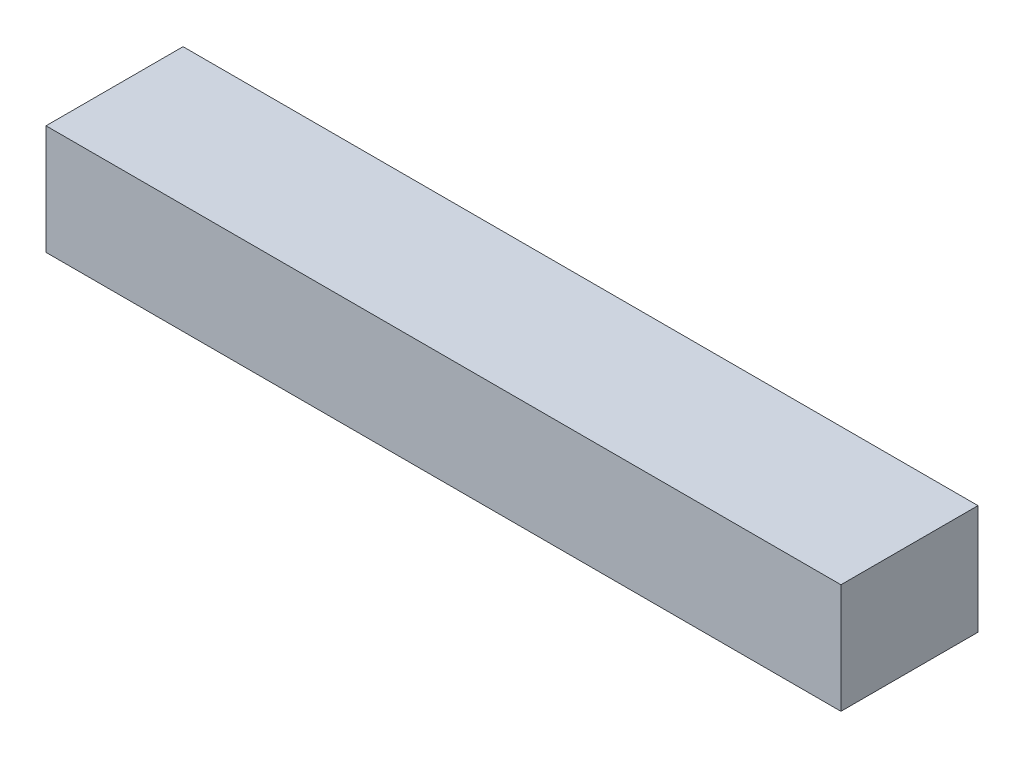
ISO-10303-21;
HEADER;
FILE_DESCRIPTION(('STEP AP214'),'2;1');
FILE_NAME('part.step','',(''),(''),'','','');
FILE_SCHEMA(('AUTOMOTIVE_DESIGN { 1 0 10303 214 1 1 1 1 }'));
ENDSEC;
DATA;
#1=APPLICATION_CONTEXT('core data for automotive mechanical design processes');
#2=APPLICATION_PROTOCOL_DEFINITION('international standard','automotive_design',2000,#1);
#3=PRODUCT_CONTEXT('',#1,'mechanical');
#4=PRODUCT('Part','Part','',(#3));
#5=PRODUCT_RELATED_PRODUCT_CATEGORY('part','',(#4));
#6=PRODUCT_DEFINITION_FORMATION('','',#4);
#7=PRODUCT_DEFINITION_CONTEXT('part definition',#1,'design');
#8=PRODUCT_DEFINITION('design','',#6,#7);
#9=PRODUCT_DEFINITION_SHAPE('','',#8);
#10=(LENGTH_UNIT() NAMED_UNIT(*) SI_UNIT(.MILLI.,.METRE.));
#11=(NAMED_UNIT(*) PLANE_ANGLE_UNIT() SI_UNIT($,.RADIAN.));
#12=(NAMED_UNIT(*) SI_UNIT($,.STERADIAN.) SOLID_ANGLE_UNIT());
#13=UNCERTAINTY_MEASURE_WITH_UNIT(LENGTH_MEASURE(1.E-05),#10,'distance_accuracy_value','');
#14=(GEOMETRIC_REPRESENTATION_CONTEXT(3) GLOBAL_UNCERTAINTY_ASSIGNED_CONTEXT((#13)) GLOBAL_UNIT_ASSIGNED_CONTEXT((#10,
#11,#12)) REPRESENTATION_CONTEXT('',''));
#15=CARTESIAN_POINT('',(0.,0.,0.));
#16=DIRECTION('',(0.,0.,1.));
#17=DIRECTION('',(1.,0.,0.));
#18=AXIS2_PLACEMENT_3D('',#15,#16,#17);
#19=CARTESIAN_POINT('',(73.66,10.16,0.));
#20=DIRECTION('',(0.,0.,-1.));
#21=DIRECTION('',(-1.,0.,0.));
#22=AXIS2_PLACEMENT_3D('',#19,#20,#21);
#23=PLANE('',#22);
#24=DIRECTION('',(1.,0.,0.));
#25=VECTOR('',#24,1.);
#26=CARTESIAN_POINT('',(73.66,0.,0.));
#27=LINE('',#26,#25);
#28=CARTESIAN_POINT('',(0.,0.,0.));
#29=VERTEX_POINT('',#28);
#30=CARTESIAN_POINT('',(73.66,0.,0.));
#31=VERTEX_POINT('',#30);
#32=EDGE_CURVE('E91',#29,#31,#27,.T.);
#33=ORIENTED_EDGE('',*,*,#32,.T.);
#34=DIRECTION('',(0.,-1.,0.));
#35=VECTOR('',#34,1.);
#36=CARTESIAN_POINT('',(73.66,10.16,0.));
#37=LINE('',#36,#35);
#38=CARTESIAN_POINT('',(73.66,10.16,0.));
#39=VERTEX_POINT('',#38);
#40=EDGE_CURVE('E11',#39,#31,#37,.T.);
#41=ORIENTED_EDGE('',*,*,#40,.F.);
#42=DIRECTION('',(1.,0.,0.));
#43=VECTOR('',#42,1.);
#44=CARTESIAN_POINT('',(73.66,10.16,0.));
#45=LINE('',#44,#43);
#46=CARTESIAN_POINT('',(0.,10.16,0.));
#47=VERTEX_POINT('',#46);
#48=EDGE_CURVE('E79',#47,#39,#45,.T.);
#49=ORIENTED_EDGE('',*,*,#48,.F.);
#50=DIRECTION('',(0.,-1.,0.));
#51=VECTOR('',#50,1.);
#52=CARTESIAN_POINT('',(0.,10.16,0.));
#53=LINE('',#52,#51);
#54=EDGE_CURVE('E87',#47,#29,#53,.T.);
#55=ORIENTED_EDGE('',*,*,#54,.T.);
#56=EDGE_LOOP('',(#33,#41,#49,#55));
#57=FACE_BOUND('',#56,.T.);
#58=ADVANCED_FACE('F28',(#57),#23,.F.);
#59=CARTESIAN_POINT('',(73.66,10.16,-12.7));
#60=DIRECTION('',(-1.,0.,0.));
#61=DIRECTION('',(0.,0.,1.));
#62=AXIS2_PLACEMENT_3D('',#59,#60,#61);
#63=PLANE('',#62);
#64=DIRECTION('',(0.,0.,-1.));
#65=VECTOR('',#64,1.);
#66=CARTESIAN_POINT('',(73.66,0.,-12.7));
#67=LINE('',#66,#65);
#68=CARTESIAN_POINT('',(73.66,0.,-12.7));
#69=VERTEX_POINT('',#68);
#70=EDGE_CURVE('E83',#31,#69,#67,.T.);
#71=ORIENTED_EDGE('',*,*,#70,.T.);
#72=DIRECTION('',(0.,-1.,0.));
#73=VECTOR('',#72,1.);
#74=CARTESIAN_POINT('',(73.66,10.16,-12.7));
#75=LINE('',#74,#73);
#76=CARTESIAN_POINT('',(73.66,10.16,-12.7));
#77=VERTEX_POINT('',#76);
#78=EDGE_CURVE('E36',#77,#69,#75,.T.);
#79=ORIENTED_EDGE('',*,*,#78,.F.);
#80=DIRECTION('',(0.,0.,-1.));
#81=VECTOR('',#80,1.);
#82=CARTESIAN_POINT('',(73.66,10.16,-12.7));
#83=LINE('',#82,#81);
#84=EDGE_CURVE('E74',#39,#77,#83,.T.);
#85=ORIENTED_EDGE('',*,*,#84,.F.);
#86=ORIENTED_EDGE('',*,*,#40,.T.);
#87=EDGE_LOOP('',(#71,#79,#85,#86));
#88=FACE_BOUND('',#87,.T.);
#89=ADVANCED_FACE('F82',(#88),#63,.F.);
#90=CARTESIAN_POINT('',(0.,10.16,-12.7));
#91=DIRECTION('',(0.,0.,1.));
#92=DIRECTION('',(1.,0.,0.));
#93=AXIS2_PLACEMENT_3D('',#90,#91,#92);
#94=PLANE('',#93);
#95=DIRECTION('',(-1.,0.,0.));
#96=VECTOR('',#95,1.);
#97=CARTESIAN_POINT('',(0.,0.,-12.7));
#98=LINE('',#97,#96);
#99=CARTESIAN_POINT('',(0.,0.,-12.7));
#100=VERTEX_POINT('',#99);
#101=EDGE_CURVE('E61',#69,#100,#98,.T.);
#102=ORIENTED_EDGE('',*,*,#101,.T.);
#103=DIRECTION('',(0.,-1.,0.));
#104=VECTOR('',#103,1.);
#105=CARTESIAN_POINT('',(0.,10.16,-12.7));
#106=LINE('',#105,#104);
#107=CARTESIAN_POINT('',(0.,10.16,-12.7));
#108=VERTEX_POINT('',#107);
#109=EDGE_CURVE('E84',#108,#100,#106,.T.);
#110=ORIENTED_EDGE('',*,*,#109,.F.);
#111=DIRECTION('',(-1.,0.,0.));
#112=VECTOR('',#111,1.);
#113=CARTESIAN_POINT('',(0.,10.16,-12.7));
#114=LINE('',#113,#112);
#115=EDGE_CURVE('E77',#77,#108,#114,.T.);
#116=ORIENTED_EDGE('',*,*,#115,.F.);
#117=ORIENTED_EDGE('',*,*,#78,.T.);
#118=EDGE_LOOP('',(#102,#110,#116,#117));
#119=FACE_BOUND('',#118,.T.);
#120=ADVANCED_FACE('F85',(#119),#94,.F.);
#121=CARTESIAN_POINT('',(0.,10.16,0.));
#122=DIRECTION('',(1.,0.,0.));
#123=DIRECTION('',(0.,0.,-1.));
#124=AXIS2_PLACEMENT_3D('',#121,#122,#123);
#125=PLANE('',#124);
#126=DIRECTION('',(0.,0.,1.));
#127=VECTOR('',#126,1.);
#128=CARTESIAN_POINT('',(0.,0.,0.));
#129=LINE('',#128,#127);
#130=EDGE_CURVE('E67',#100,#29,#129,.T.);
#131=ORIENTED_EDGE('',*,*,#130,.T.);
#132=ORIENTED_EDGE('',*,*,#54,.F.);
#133=DIRECTION('',(0.,0.,1.));
#134=VECTOR('',#133,1.);
#135=CARTESIAN_POINT('',(0.,10.16,0.));
#136=LINE('',#135,#134);
#137=EDGE_CURVE('E44',#108,#47,#136,.T.);
#138=ORIENTED_EDGE('',*,*,#137,.F.);
#139=ORIENTED_EDGE('',*,*,#109,.T.);
#140=EDGE_LOOP('',(#131,#132,#138,#139));
#141=FACE_BOUND('',#140,.T.);
#142=ADVANCED_FACE('F98',(#141),#125,.F.);
#143=CARTESIAN_POINT('',(0.,10.16,0.));
#144=DIRECTION('',(0.,-1.,0.));
#145=DIRECTION('',(0.,0.,-1.));
#146=AXIS2_PLACEMENT_3D('',#143,#144,#145);
#147=PLANE('',#146);
#148=ORIENTED_EDGE('',*,*,#48,.T.);
#149=ORIENTED_EDGE('',*,*,#84,.T.);
#150=ORIENTED_EDGE('',*,*,#115,.T.);
#151=ORIENTED_EDGE('',*,*,#137,.T.);
#152=EDGE_LOOP('',(#148,#149,#150,#151));
#153=FACE_BOUND('',#152,.T.);
#154=ADVANCED_FACE('F75',(#153),#147,.F.);
#155=CARTESIAN_POINT('',(0.,0.,0.));
#156=DIRECTION('',(0.,-1.,0.));
#157=DIRECTION('',(0.,0.,-1.));
#158=AXIS2_PLACEMENT_3D('',#155,#156,#157);
#159=PLANE('',#158);
#160=ORIENTED_EDGE('',*,*,#32,.F.);
#161=ORIENTED_EDGE('',*,*,#130,.F.);
#162=ORIENTED_EDGE('',*,*,#101,.F.);
#163=ORIENTED_EDGE('',*,*,#70,.F.);
#164=EDGE_LOOP('',(#160,#161,#162,#163));
#165=FACE_BOUND('',#164,.T.);
#166=ADVANCED_FACE('F101',(#165),#159,.T.);
#167=CLOSED_SHELL('',(#58,#89,#120,#142,#154,#166));
#168=MANIFOLD_SOLID_BREP('B2',#167);
#169=ADVANCED_BREP_SHAPE_REPRESENTATION('',(#18,#168),#14);
#170=SHAPE_DEFINITION_REPRESENTATION(#9,#169);
ENDSEC;
END-ISO-10303-21;
